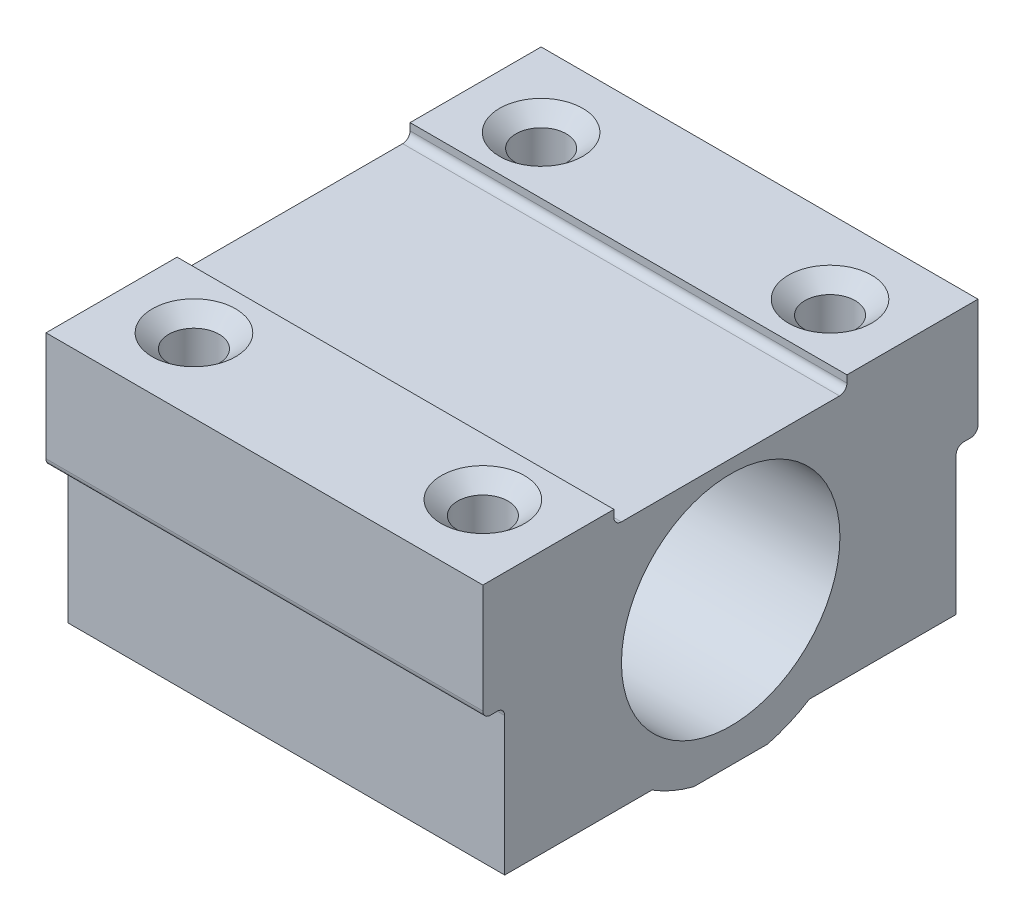
ISO-10303-21;
HEADER;
FILE_DESCRIPTION(('STEP AP214'),'2;1');
FILE_NAME('part.step','',(''),(''),'','','');
FILE_SCHEMA(('AUTOMOTIVE_DESIGN { 1 0 10303 214 1 1 1 1 }'));
ENDSEC;
DATA;
#1=APPLICATION_CONTEXT('core data for automotive mechanical design processes');
#2=APPLICATION_PROTOCOL_DEFINITION('international standard','automotive_design',2000,#1);
#3=PRODUCT_CONTEXT('',#1,'mechanical');
#4=PRODUCT('Part','Part','',(#3));
#5=PRODUCT_RELATED_PRODUCT_CATEGORY('part','',(#4));
#6=PRODUCT_DEFINITION_FORMATION('','',#4);
#7=PRODUCT_DEFINITION_CONTEXT('part definition',#1,'design');
#8=PRODUCT_DEFINITION('design','',#6,#7);
#9=PRODUCT_DEFINITION_SHAPE('','',#8);
#10=(LENGTH_UNIT() NAMED_UNIT(*) SI_UNIT(.MILLI.,.METRE.));
#11=(NAMED_UNIT(*) PLANE_ANGLE_UNIT() SI_UNIT($,.RADIAN.));
#12=(NAMED_UNIT(*) SI_UNIT($,.STERADIAN.) SOLID_ANGLE_UNIT());
#13=UNCERTAINTY_MEASURE_WITH_UNIT(LENGTH_MEASURE(1.E-05),#10,'distance_accuracy_value','');
#14=(GEOMETRIC_REPRESENTATION_CONTEXT(3) GLOBAL_UNCERTAINTY_ASSIGNED_CONTEXT((#13)) GLOBAL_UNIT_ASSIGNED_CONTEXT((#10,
#11,#12)) REPRESENTATION_CONTEXT('',''));
#15=CARTESIAN_POINT('',(0.,0.,0.));
#16=DIRECTION('',(0.,0.,1.));
#17=DIRECTION('',(1.,0.,0.));
#18=AXIS2_PLACEMENT_3D('',#15,#16,#17);
#19=CARTESIAN_POINT('',(30.,8.,0.));
#20=DIRECTION('',(0.,-1.,0.));
#21=DIRECTION('',(0.,0.,-1.));
#22=AXIS2_PLACEMENT_3D('',#19,#20,#21);
#23=PLANE('',#22);
#24=CARTESIAN_POINT('',(24.92,8.,-5.08));
#25=DIRECTION('',(0.,1.,0.));
#26=DIRECTION('',(0.,0.,1.));
#27=AXIS2_PLACEMENT_3D('',#24,#25,#26);
#28=CIRCLE('',#27,2.8575);
#29=CARTESIAN_POINT('',(24.92,8.,-2.2225));
#30=VERTEX_POINT('',#29);
#31=EDGE_CURVE('E225',#30,#30,#28,.T.);
#32=ORIENTED_EDGE('',*,*,#31,.F.);
#33=EDGE_LOOP('',(#32));
#34=FACE_BOUND('',#33,.T.);
#35=DIRECTION('',(0.,0.,1.));
#36=VECTOR('',#35,1.);
#37=CARTESIAN_POINT('',(0.,8.,0.));
#38=LINE('',#37,#36);
#39=CARTESIAN_POINT('',(0.,8.,-9.));
#40=VERTEX_POINT('',#39);
#41=CARTESIAN_POINT('',(0.,8.,0.));
#42=VERTEX_POINT('',#41);
#43=EDGE_CURVE('E320',#40,#42,#38,.T.);
#44=ORIENTED_EDGE('',*,*,#43,.T.);
#45=DIRECTION('',(-1.,0.,0.));
#46=VECTOR('',#45,1.);
#47=CARTESIAN_POINT('',(30.,8.,0.));
#48=LINE('',#47,#46);
#49=CARTESIAN_POINT('',(30.,8.,0.));
#50=VERTEX_POINT('',#49);
#51=EDGE_CURVE('E288',#50,#42,#48,.T.);
#52=ORIENTED_EDGE('',*,*,#51,.F.);
#53=DIRECTION('',(0.,0.,1.));
#54=VECTOR('',#53,1.);
#55=CARTESIAN_POINT('',(30.,8.,0.));
#56=LINE('',#55,#54);
#57=CARTESIAN_POINT('',(30.,8.,-9.));
#58=VERTEX_POINT('',#57);
#59=EDGE_CURVE('E285',#58,#50,#56,.T.);
#60=ORIENTED_EDGE('',*,*,#59,.F.);
#61=DIRECTION('',(-1.,0.,0.));
#62=VECTOR('',#61,1.);
#63=CARTESIAN_POINT('',(30.,8.,-9.));
#64=LINE('',#63,#62);
#65=EDGE_CURVE('E326',#58,#40,#64,.T.);
#66=ORIENTED_EDGE('',*,*,#65,.T.);
#67=EDGE_LOOP('',(#44,#52,#60,#66));
#68=FACE_BOUND('',#67,.T.);
#69=CARTESIAN_POINT('',(5.08,8.,-5.08));
#70=DIRECTION('',(0.,1.,0.));
#71=DIRECTION('',(0.,0.,1.));
#72=AXIS2_PLACEMENT_3D('',#69,#70,#71);
#73=CIRCLE('',#72,2.8575);
#74=CARTESIAN_POINT('',(5.08,8.,-2.2225));
#75=VERTEX_POINT('',#74);
#76=EDGE_CURVE('E234',#75,#75,#73,.T.);
#77=ORIENTED_EDGE('',*,*,#76,.F.);
#78=EDGE_LOOP('',(#77));
#79=FACE_BOUND('',#78,.T.);
#80=ADVANCED_FACE('F39',(#34,#68,#79),#23,.F.);
#81=CARTESIAN_POINT('',(30.,-1.398,-17.018));
#82=DIRECTION('',(1.,0.,0.));
#83=DIRECTION('',(0.,0.,-1.));
#84=AXIS2_PLACEMENT_3D('',#81,#82,#83);
#85=PLANE('',#84);
#86=DIRECTION('',(0.,0.,-1.));
#87=VECTOR('',#86,1.);
#88=CARTESIAN_POINT('',(30.,0.,-32.5));
#89=LINE('',#88,#87);
#90=CARTESIAN_POINT('',(30.,0.,-33.008));
#91=VERTEX_POINT('',#90);
#92=CARTESIAN_POINT('',(30.,0.,-33.492));
#93=VERTEX_POINT('',#92);
#94=EDGE_CURVE('E270',#91,#93,#89,.T.);
#95=ORIENTED_EDGE('',*,*,#94,.T.);
#96=CARTESIAN_POINT('',(30.,0.508,-33.492));
#97=DIRECTION('',(1.,0.,0.));
#98=DIRECTION('',(0.,0.,-1.));
#99=AXIS2_PLACEMENT_3D('',#96,#97,#98);
#100=CIRCLE('',#99,0.508);
#101=CARTESIAN_POINT('',(30.,0.508,-34.));
#102=VERTEX_POINT('',#101);
#103=EDGE_CURVE('E377',#93,#102,#100,.T.);
#104=ORIENTED_EDGE('',*,*,#103,.T.);
#105=DIRECTION('',(0.,1.,0.));
#106=VECTOR('',#105,1.);
#107=CARTESIAN_POINT('',(30.,0.,-34.));
#108=LINE('',#107,#106);
#109=CARTESIAN_POINT('',(30.,8.,-34.));
#110=VERTEX_POINT('',#109);
#111=EDGE_CURVE('E273',#102,#110,#108,.T.);
#112=ORIENTED_EDGE('',*,*,#111,.T.);
#113=DIRECTION('',(0.,0.,1.));
#114=VECTOR('',#113,1.);
#115=CARTESIAN_POINT('',(30.,8.,-34.));
#116=LINE('',#115,#114);
#117=CARTESIAN_POINT('',(30.,8.,-25.));
#118=VERTEX_POINT('',#117);
#119=EDGE_CURVE('E275',#110,#118,#116,.T.);
#120=ORIENTED_EDGE('',*,*,#119,.T.);
#121=DIRECTION('',(0.,-1.,0.));
#122=VECTOR('',#121,1.);
#123=CARTESIAN_POINT('',(30.,7.,-25.));
#124=LINE('',#123,#122);
#125=CARTESIAN_POINT('',(30.,7.508,-25.));
#126=VERTEX_POINT('',#125);
#127=EDGE_CURVE('E277',#118,#126,#124,.T.);
#128=ORIENTED_EDGE('',*,*,#127,.T.);
#129=CARTESIAN_POINT('',(30.,7.508,-24.492));
#130=DIRECTION('',(1.,0.,0.));
#131=DIRECTION('',(0.,0.,-1.));
#132=AXIS2_PLACEMENT_3D('',#129,#130,#131);
#133=CIRCLE('',#132,0.508);
#134=CARTESIAN_POINT('',(30.,7.,-24.492));
#135=VERTEX_POINT('',#134);
#136=EDGE_CURVE('E392',#126,#135,#133,.F.);
#137=ORIENTED_EDGE('',*,*,#136,.T.);
#138=DIRECTION('',(0.,0.,1.));
#139=VECTOR('',#138,1.);
#140=CARTESIAN_POINT('',(30.,7.,-9.));
#141=LINE('',#140,#139);
#142=CARTESIAN_POINT('',(30.,7.,-9.508));
#143=VERTEX_POINT('',#142);
#144=EDGE_CURVE('E280',#135,#143,#141,.T.);
#145=ORIENTED_EDGE('',*,*,#144,.T.);
#146=CARTESIAN_POINT('',(30.,7.508,-9.508));
#147=DIRECTION('',(1.,0.,0.));
#148=DIRECTION('',(0.,0.,-1.));
#149=AXIS2_PLACEMENT_3D('',#146,#147,#148);
#150=CIRCLE('',#149,0.508);
#151=CARTESIAN_POINT('',(30.,7.508,-9.));
#152=VERTEX_POINT('',#151);
#153=EDGE_CURVE('E396',#143,#152,#150,.F.);
#154=ORIENTED_EDGE('',*,*,#153,.T.);
#155=DIRECTION('',(0.,1.,0.));
#156=VECTOR('',#155,1.);
#157=CARTESIAN_POINT('',(30.,7.,-9.));
#158=LINE('',#157,#156);
#159=EDGE_CURVE('E283',#152,#58,#158,.T.);
#160=ORIENTED_EDGE('',*,*,#159,.T.);
#161=ORIENTED_EDGE('',*,*,#59,.T.);
#162=DIRECTION('',(0.,-1.,0.));
#163=VECTOR('',#162,1.);
#164=CARTESIAN_POINT('',(30.,0.,0.));
#165=LINE('',#164,#163);
#166=CARTESIAN_POINT('',(30.,0.508,0.));
#167=VERTEX_POINT('',#166);
#168=EDGE_CURVE('E250',#50,#167,#165,.T.);
#169=ORIENTED_EDGE('',*,*,#168,.T.);
#170=CARTESIAN_POINT('',(30.,0.508,-0.508));
#171=DIRECTION('',(1.,0.,0.));
#172=DIRECTION('',(0.,0.,-1.));
#173=AXIS2_PLACEMENT_3D('',#170,#171,#172);
#174=CIRCLE('',#173,0.508);
#175=CARTESIAN_POINT('',(30.,0.,-0.508));
#176=VERTEX_POINT('',#175);
#177=EDGE_CURVE('E375',#167,#176,#174,.T.);
#178=ORIENTED_EDGE('',*,*,#177,.T.);
#179=DIRECTION('',(0.,0.,-1.));
#180=VECTOR('',#179,1.);
#181=CARTESIAN_POINT('',(30.,0.,0.));
#182=LINE('',#181,#180);
#183=CARTESIAN_POINT('',(30.,0.,-0.992000000000001));
#184=VERTEX_POINT('',#183);
#185=EDGE_CURVE('E253',#176,#184,#182,.T.);
#186=ORIENTED_EDGE('',*,*,#185,.T.);
#187=CARTESIAN_POINT('',(30.,-0.508,-0.992000000000001));
#188=DIRECTION('',(1.,0.,0.));
#189=DIRECTION('',(0.,0.,-1.));
#190=AXIS2_PLACEMENT_3D('',#187,#188,#189);
#191=CIRCLE('',#190,0.508);
#192=CARTESIAN_POINT('',(30.,-0.508,-1.5));
#193=VERTEX_POINT('',#192);
#194=EDGE_CURVE('E11',#184,#193,#191,.F.);
#195=ORIENTED_EDGE('',*,*,#194,.T.);
#196=DIRECTION('',(0.,-1.,0.));
#197=VECTOR('',#196,1.);
#198=CARTESIAN_POINT('',(30.,0.,-1.5));
#199=LINE('',#198,#197);
#200=CARTESIAN_POINT('',(30.,-10.,-1.5));
#201=VERTEX_POINT('',#200);
#202=EDGE_CURVE('E256',#193,#201,#199,.T.);
#203=ORIENTED_EDGE('',*,*,#202,.T.);
#204=DIRECTION('',(0.,0.,-1.));
#205=VECTOR('',#204,1.);
#206=CARTESIAN_POINT('',(30.,-10.,-1.5));
#207=LINE('',#206,#205);
#208=CARTESIAN_POINT('',(30.,-10.,-11.6114117967058));
#209=VERTEX_POINT('',#208);
#210=EDGE_CURVE('E258',#201,#209,#207,.T.);
#211=ORIENTED_EDGE('',*,*,#210,.T.);
#212=CARTESIAN_POINT('',(30.,-1.398,-17.018));
#213=DIRECTION('',(1.,0.,0.));
#214=DIRECTION('',(0.,0.,-1.));
#215=AXIS2_PLACEMENT_3D('',#212,#213,#214);
#216=CIRCLE('',#215,10.16);
#217=CARTESIAN_POINT('',(30.,-11.2375684973966,-14.4865000918347));
#218=VERTEX_POINT('',#217);
#219=EDGE_CURVE('E260',#209,#218,#216,.T.);
#220=ORIENTED_EDGE('',*,*,#219,.T.);
#221=DIRECTION('',(0.,0.,-1.));
#222=VECTOR('',#221,1.);
#223=CARTESIAN_POINT('',(30.,-11.2375684973966,-14.4865000918347));
#224=LINE('',#223,#222);
#225=CARTESIAN_POINT('',(30.,-11.2375684973966,-19.5494999081653));
#226=VERTEX_POINT('',#225);
#227=EDGE_CURVE('E262',#218,#226,#224,.T.);
#228=ORIENTED_EDGE('',*,*,#227,.T.);
#229=CARTESIAN_POINT('',(30.,-1.398,-17.018));
#230=DIRECTION('',(1.,0.,0.));
#231=DIRECTION('',(0.,0.,-1.));
#232=AXIS2_PLACEMENT_3D('',#229,#230,#231);
#233=CIRCLE('',#232,10.16);
#234=CARTESIAN_POINT('',(30.,-10.,-22.4245882032942));
#235=VERTEX_POINT('',#234);
#236=EDGE_CURVE('E264',#226,#235,#233,.T.);
#237=ORIENTED_EDGE('',*,*,#236,.T.);
#238=DIRECTION('',(0.,0.,-1.));
#239=VECTOR('',#238,1.);
#240=CARTESIAN_POINT('',(30.,-10.,-22.4245882032942));
#241=LINE('',#240,#239);
#242=CARTESIAN_POINT('',(30.,-10.,-32.5));
#243=VERTEX_POINT('',#242);
#244=EDGE_CURVE('E266',#235,#243,#241,.T.);
#245=ORIENTED_EDGE('',*,*,#244,.T.);
#246=DIRECTION('',(0.,1.,0.));
#247=VECTOR('',#246,1.);
#248=CARTESIAN_POINT('',(30.,0.,-32.5));
#249=LINE('',#248,#247);
#250=CARTESIAN_POINT('',(30.,-0.508,-32.5));
#251=VERTEX_POINT('',#250);
#252=EDGE_CURVE('E268',#243,#251,#249,.T.);
#253=ORIENTED_EDGE('',*,*,#252,.T.);
#254=CARTESIAN_POINT('',(30.,-0.508,-33.008));
#255=DIRECTION('',(1.,0.,0.));
#256=DIRECTION('',(0.,0.,-1.));
#257=AXIS2_PLACEMENT_3D('',#254,#255,#256);
#258=CIRCLE('',#257,0.508);
#259=EDGE_CURVE('E400',#251,#91,#258,.F.);
#260=ORIENTED_EDGE('',*,*,#259,.T.);
#261=EDGE_LOOP('',(#95,#104,#112,#120,#128,#137,#145,#154,#160,#161,#169,#178,#186,#195,#203,
#211,#220,#228,#237,#245,#253,#260));
#262=FACE_BOUND('',#261,.T.);
#263=CARTESIAN_POINT('',(30.,-1.398,-17.018));
#264=DIRECTION('',(1.,0.,0.));
#265=DIRECTION('',(0.,0.,-1.));
#266=AXIS2_PLACEMENT_3D('',#263,#264,#265);
#267=CIRCLE('',#266,7.5);
#268=CARTESIAN_POINT('',(30.,-1.398,-24.518));
#269=VERTEX_POINT('',#268);
#270=EDGE_CURVE('E244',#269,#269,#267,.T.);
#271=ORIENTED_EDGE('',*,*,#270,.F.);
#272=EDGE_LOOP('',(#271));
#273=FACE_BOUND('',#272,.T.);
#274=ADVANCED_FACE('F419',(#262,#273),#85,.T.);
#275=CARTESIAN_POINT('',(0.,-1.398,-17.018));
#276=DIRECTION('',(1.,0.,0.));
#277=DIRECTION('',(0.,0.,-1.));
#278=AXIS2_PLACEMENT_3D('',#275,#276,#277);
#279=PLANE('',#278);
#280=DIRECTION('',(0.,1.,0.));
#281=VECTOR('',#280,1.);
#282=CARTESIAN_POINT('',(0.,7.49375,-34.));
#283=LINE('',#282,#281);
#284=CARTESIAN_POINT('',(0.,0.508,-34.));
#285=VERTEX_POINT('',#284);
#286=CARTESIAN_POINT('',(0.,8.,-34.));
#287=VERTEX_POINT('',#286);
#288=EDGE_CURVE('E308',#285,#287,#283,.T.);
#289=ORIENTED_EDGE('',*,*,#288,.F.);
#290=CARTESIAN_POINT('',(0.,0.508,-33.492));
#291=DIRECTION('',(1.,0.,0.));
#292=DIRECTION('',(0.,0.,-1.));
#293=AXIS2_PLACEMENT_3D('',#290,#291,#292);
#294=CIRCLE('',#293,0.508);
#295=CARTESIAN_POINT('',(0.,0.,-33.492));
#296=VERTEX_POINT('',#295);
#297=EDGE_CURVE('E368',#285,#296,#294,.F.);
#298=ORIENTED_EDGE('',*,*,#297,.T.);
#299=DIRECTION('',(0.,0.,-1.));
#300=VECTOR('',#299,1.);
#301=CARTESIAN_POINT('',(0.,0.,-32.5));
#302=LINE('',#301,#300);
#303=CARTESIAN_POINT('',(0.,0.,-33.008));
#304=VERTEX_POINT('',#303);
#305=EDGE_CURVE('E305',#304,#296,#302,.T.);
#306=ORIENTED_EDGE('',*,*,#305,.F.);
#307=CARTESIAN_POINT('',(0.,-0.508,-33.008));
#308=DIRECTION('',(1.,0.,0.));
#309=DIRECTION('',(0.,0.,-1.));
#310=AXIS2_PLACEMENT_3D('',#307,#308,#309);
#311=CIRCLE('',#310,0.508);
#312=CARTESIAN_POINT('',(0.,-0.508,-32.5));
#313=VERTEX_POINT('',#312);
#314=EDGE_CURVE('E398',#304,#313,#311,.T.);
#315=ORIENTED_EDGE('',*,*,#314,.T.);
#316=DIRECTION('',(0.,1.,0.));
#317=VECTOR('',#316,1.);
#318=CARTESIAN_POINT('',(0.,0.,-32.5));
#319=LINE('',#318,#317);
#320=CARTESIAN_POINT('',(0.,-10.,-32.5));
#321=VERTEX_POINT('',#320);
#322=EDGE_CURVE('E303',#321,#313,#319,.T.);
#323=ORIENTED_EDGE('',*,*,#322,.F.);
#324=DIRECTION('',(0.,0.,-1.));
#325=VECTOR('',#324,1.);
#326=CARTESIAN_POINT('',(0.,-10.,-22.4245882032942));
#327=LINE('',#326,#325);
#328=CARTESIAN_POINT('',(0.,-10.,-22.4245882032942));
#329=VERTEX_POINT('',#328);
#330=EDGE_CURVE('E301',#329,#321,#327,.T.);
#331=ORIENTED_EDGE('',*,*,#330,.F.);
#332=CARTESIAN_POINT('',(0.,-1.398,-17.018));
#333=DIRECTION('',(1.,0.,0.));
#334=DIRECTION('',(0.,0.,-1.));
#335=AXIS2_PLACEMENT_3D('',#332,#333,#334);
#336=CIRCLE('',#335,10.16);
#337=CARTESIAN_POINT('',(0.,-11.2375684973966,-19.5494999081653));
#338=VERTEX_POINT('',#337);
#339=EDGE_CURVE('E299',#338,#329,#336,.T.);
#340=ORIENTED_EDGE('',*,*,#339,.F.);
#341=DIRECTION('',(0.,0.,-1.));
#342=VECTOR('',#341,1.);
#343=CARTESIAN_POINT('',(0.,-11.2375684973966,-14.4865000918347));
#344=LINE('',#343,#342);
#345=CARTESIAN_POINT('',(0.,-11.2375684973966,-14.4865000918347));
#346=VERTEX_POINT('',#345);
#347=EDGE_CURVE('E297',#346,#338,#344,.T.);
#348=ORIENTED_EDGE('',*,*,#347,.F.);
#349=CARTESIAN_POINT('',(0.,-1.398,-17.018));
#350=DIRECTION('',(1.,0.,0.));
#351=DIRECTION('',(0.,0.,-1.));
#352=AXIS2_PLACEMENT_3D('',#349,#350,#351);
#353=CIRCLE('',#352,10.16);
#354=CARTESIAN_POINT('',(0.,-10.,-11.6114117967058));
#355=VERTEX_POINT('',#354);
#356=EDGE_CURVE('E295',#355,#346,#353,.T.);
#357=ORIENTED_EDGE('',*,*,#356,.F.);
#358=DIRECTION('',(0.,0.,-1.));
#359=VECTOR('',#358,1.);
#360=CARTESIAN_POINT('',(0.,-10.,-1.5));
#361=LINE('',#360,#359);
#362=CARTESIAN_POINT('',(0.,-10.,-1.5));
#363=VERTEX_POINT('',#362);
#364=EDGE_CURVE('E293',#363,#355,#361,.T.);
#365=ORIENTED_EDGE('',*,*,#364,.F.);
#366=DIRECTION('',(0.,-1.,0.));
#367=VECTOR('',#366,1.);
#368=CARTESIAN_POINT('',(0.,0.,-1.5));
#369=LINE('',#368,#367);
#370=CARTESIAN_POINT('',(0.,-0.508,-1.5));
#371=VERTEX_POINT('',#370);
#372=EDGE_CURVE('E291',#371,#363,#369,.T.);
#373=ORIENTED_EDGE('',*,*,#372,.F.);
#374=CARTESIAN_POINT('',(0.,-0.508,-0.992000000000001));
#375=DIRECTION('',(1.,0.,0.));
#376=DIRECTION('',(0.,0.,-1.));
#377=AXIS2_PLACEMENT_3D('',#374,#375,#376);
#378=CIRCLE('',#377,0.508);
#379=CARTESIAN_POINT('',(0.,0.,-0.992000000000001));
#380=VERTEX_POINT('',#379);
#381=EDGE_CURVE('E47',#371,#380,#378,.T.);
#382=ORIENTED_EDGE('',*,*,#381,.T.);
#383=DIRECTION('',(0.,0.,-1.));
#384=VECTOR('',#383,1.);
#385=CARTESIAN_POINT('',(0.,0.,0.));
#386=LINE('',#385,#384);
#387=CARTESIAN_POINT('',(0.,0.,-0.508));
#388=VERTEX_POINT('',#387);
#389=EDGE_CURVE('E247',#388,#380,#386,.T.);
#390=ORIENTED_EDGE('',*,*,#389,.F.);
#391=CARTESIAN_POINT('',(0.,0.508,-0.508));
#392=DIRECTION('',(1.,0.,0.));
#393=DIRECTION('',(0.,0.,-1.));
#394=AXIS2_PLACEMENT_3D('',#391,#392,#393);
#395=CIRCLE('',#394,0.508);
#396=CARTESIAN_POINT('',(0.,0.508,0.));
#397=VERTEX_POINT('',#396);
#398=EDGE_CURVE('E366',#388,#397,#395,.F.);
#399=ORIENTED_EDGE('',*,*,#398,.T.);
#400=DIRECTION('',(0.,-1.,0.));
#401=VECTOR('',#400,1.);
#402=CARTESIAN_POINT('',(0.,7.49375,0.));
#403=LINE('',#402,#401);
#404=EDGE_CURVE('E254',#42,#397,#403,.T.);
#405=ORIENTED_EDGE('',*,*,#404,.F.);
#406=ORIENTED_EDGE('',*,*,#43,.F.);
#407=DIRECTION('',(0.,1.,0.));
#408=VECTOR('',#407,1.);
#409=CARTESIAN_POINT('',(0.,7.,-9.));
#410=LINE('',#409,#408);
#411=CARTESIAN_POINT('',(0.,7.508,-9.));
#412=VERTEX_POINT('',#411);
#413=EDGE_CURVE('E318',#412,#40,#410,.T.);
#414=ORIENTED_EDGE('',*,*,#413,.F.);
#415=CARTESIAN_POINT('',(0.,7.508,-9.508));
#416=DIRECTION('',(1.,0.,0.));
#417=DIRECTION('',(0.,0.,-1.));
#418=AXIS2_PLACEMENT_3D('',#415,#416,#417);
#419=CIRCLE('',#418,0.508);
#420=CARTESIAN_POINT('',(0.,7.,-9.508));
#421=VERTEX_POINT('',#420);
#422=EDGE_CURVE('E394',#412,#421,#419,.T.);
#423=ORIENTED_EDGE('',*,*,#422,.T.);
#424=DIRECTION('',(0.,0.,1.));
#425=VECTOR('',#424,1.);
#426=CARTESIAN_POINT('',(0.,7.,-9.));
#427=LINE('',#426,#425);
#428=CARTESIAN_POINT('',(0.,7.,-24.492));
#429=VERTEX_POINT('',#428);
#430=EDGE_CURVE('E315',#429,#421,#427,.T.);
#431=ORIENTED_EDGE('',*,*,#430,.F.);
#432=CARTESIAN_POINT('',(0.,7.508,-24.492));
#433=DIRECTION('',(1.,0.,0.));
#434=DIRECTION('',(0.,0.,-1.));
#435=AXIS2_PLACEMENT_3D('',#432,#433,#434);
#436=CIRCLE('',#435,0.508);
#437=CARTESIAN_POINT('',(0.,7.508,-25.));
#438=VERTEX_POINT('',#437);
#439=EDGE_CURVE('E390',#429,#438,#436,.T.);
#440=ORIENTED_EDGE('',*,*,#439,.T.);
#441=DIRECTION('',(0.,-1.,0.));
#442=VECTOR('',#441,1.);
#443=CARTESIAN_POINT('',(0.,7.,-25.));
#444=LINE('',#443,#442);
#445=CARTESIAN_POINT('',(0.,8.,-25.));
#446=VERTEX_POINT('',#445);
#447=EDGE_CURVE('E312',#446,#438,#444,.T.);
#448=ORIENTED_EDGE('',*,*,#447,.F.);
#449=DIRECTION('',(0.,0.,1.));
#450=VECTOR('',#449,1.);
#451=CARTESIAN_POINT('',(0.,8.,-34.));
#452=LINE('',#451,#450);
#453=EDGE_CURVE('E310',#287,#446,#452,.T.);
#454=ORIENTED_EDGE('',*,*,#453,.F.);
#455=EDGE_LOOP('',(#289,#298,#306,#315,#323,#331,#340,#348,#357,#365,#373,#382,#390,#399,#405,
#406,#414,#423,#431,#440,#448,#454));
#456=FACE_BOUND('',#455,.T.);
#457=CARTESIAN_POINT('',(0.,-1.398,-17.018));
#458=DIRECTION('',(1.,0.,0.));
#459=DIRECTION('',(0.,0.,-1.));
#460=AXIS2_PLACEMENT_3D('',#457,#458,#459);
#461=CIRCLE('',#460,7.5);
#462=CARTESIAN_POINT('',(0.,-1.398,-24.518));
#463=VERTEX_POINT('',#462);
#464=EDGE_CURVE('E243',#463,#463,#461,.T.);
#465=ORIENTED_EDGE('',*,*,#464,.T.);
#466=EDGE_LOOP('',(#465));
#467=FACE_BOUND('',#466,.T.);
#468=ADVANCED_FACE('F405',(#456,#467),#279,.F.);
#469=CARTESIAN_POINT('',(30.,0.,0.));
#470=DIRECTION('',(0.,1.,0.));
#471=DIRECTION('',(0.,0.,1.));
#472=AXIS2_PLACEMENT_3D('',#469,#470,#471);
#473=PLANE('',#472);
#474=ORIENTED_EDGE('',*,*,#185,.F.);
#475=DIRECTION('',(-1.,0.,0.));
#476=VECTOR('',#475,1.);
#477=CARTESIAN_POINT('',(30.,0.,-0.508));
#478=LINE('',#477,#476);
#479=EDGE_CURVE('E382',#176,#388,#478,.T.);
#480=ORIENTED_EDGE('',*,*,#479,.T.);
#481=ORIENTED_EDGE('',*,*,#389,.T.);
#482=DIRECTION('',(-1.,0.,0.));
#483=VECTOR('',#482,1.);
#484=CARTESIAN_POINT('',(30.,0.,-0.992000000000001));
#485=LINE('',#484,#483);
#486=EDGE_CURVE('E380',#380,#184,#485,.F.);
#487=ORIENTED_EDGE('',*,*,#486,.T.);
#488=EDGE_LOOP('',(#474,#480,#481,#487));
#489=FACE_BOUND('',#488,.T.);
#490=ADVANCED_FACE('F413',(#489),#473,.F.);
#491=CARTESIAN_POINT('',(30.,0.,-1.5));
#492=DIRECTION('',(0.,0.,-1.));
#493=DIRECTION('',(0.,1.,0.));
#494=AXIS2_PLACEMENT_3D('',#491,#492,#493);
#495=PLANE('',#494);
#496=ORIENTED_EDGE('',*,*,#202,.F.);
#497=DIRECTION('',(-1.,0.,0.));
#498=VECTOR('',#497,1.);
#499=CARTESIAN_POINT('',(0.,-0.508,-1.5));
#500=LINE('',#499,#498);
#501=EDGE_CURVE('E387',#193,#371,#500,.T.);
#502=ORIENTED_EDGE('',*,*,#501,.T.);
#503=ORIENTED_EDGE('',*,*,#372,.T.);
#504=DIRECTION('',(-1.,0.,0.));
#505=VECTOR('',#504,1.);
#506=CARTESIAN_POINT('',(30.,-10.,-1.5));
#507=LINE('',#506,#505);
#508=EDGE_CURVE('E350',#201,#363,#507,.T.);
#509=ORIENTED_EDGE('',*,*,#508,.F.);
#510=EDGE_LOOP('',(#496,#502,#503,#509));
#511=FACE_BOUND('',#510,.T.);
#512=ADVANCED_FACE('F416',(#511),#495,.F.);
#513=CARTESIAN_POINT('',(30.,-10.,-1.5));
#514=DIRECTION('',(0.,1.,0.));
#515=DIRECTION('',(0.,0.,1.));
#516=AXIS2_PLACEMENT_3D('',#513,#514,#515);
#517=PLANE('',#516);
#518=ORIENTED_EDGE('',*,*,#364,.T.);
#519=DIRECTION('',(-1.,0.,0.));
#520=VECTOR('',#519,1.);
#521=CARTESIAN_POINT('',(30.,-10.,-11.6114117967058));
#522=LINE('',#521,#520);
#523=EDGE_CURVE('E347',#209,#355,#522,.T.);
#524=ORIENTED_EDGE('',*,*,#523,.F.);
#525=ORIENTED_EDGE('',*,*,#210,.F.);
#526=ORIENTED_EDGE('',*,*,#508,.T.);
#527=EDGE_LOOP('',(#518,#524,#525,#526));
#528=FACE_BOUND('',#527,.T.);
#529=ADVANCED_FACE('F425',(#528),#517,.F.);
#530=CARTESIAN_POINT('',(30.,-1.398,-17.018));
#531=DIRECTION('',(-1.,0.,0.));
#532=DIRECTION('',(0.,0.,1.));
#533=AXIS2_PLACEMENT_3D('',#530,#531,#532);
#534=CYLINDRICAL_SURFACE('',#533,10.16);
#535=ORIENTED_EDGE('',*,*,#356,.T.);
#536=DIRECTION('',(-1.,0.,0.));
#537=VECTOR('',#536,1.);
#538=CARTESIAN_POINT('',(30.,-11.2375684973966,-14.4865000918347));
#539=LINE('',#538,#537);
#540=EDGE_CURVE('E344',#218,#346,#539,.T.);
#541=ORIENTED_EDGE('',*,*,#540,.F.);
#542=ORIENTED_EDGE('',*,*,#219,.F.);
#543=ORIENTED_EDGE('',*,*,#523,.T.);
#544=EDGE_LOOP('',(#535,#541,#542,#543));
#545=FACE_BOUND('',#544,.T.);
#546=ADVANCED_FACE('F428',(#545),#534,.T.);
#547=CARTESIAN_POINT('',(30.,-11.2375684973966,-14.4865000918347));
#548=DIRECTION('',(0.,1.,0.));
#549=DIRECTION('',(0.,0.,1.));
#550=AXIS2_PLACEMENT_3D('',#547,#548,#549);
#551=PLANE('',#550);
#552=ORIENTED_EDGE('',*,*,#347,.T.);
#553=DIRECTION('',(-1.,0.,0.));
#554=VECTOR('',#553,1.);
#555=CARTESIAN_POINT('',(30.,-11.2375684973966,-19.5494999081653));
#556=LINE('',#555,#554);
#557=EDGE_CURVE('E341',#226,#338,#556,.T.);
#558=ORIENTED_EDGE('',*,*,#557,.F.);
#559=ORIENTED_EDGE('',*,*,#227,.F.);
#560=ORIENTED_EDGE('',*,*,#540,.T.);
#561=EDGE_LOOP('',(#552,#558,#559,#560));
#562=FACE_BOUND('',#561,.T.);
#563=ADVANCED_FACE('F433',(#562),#551,.F.);
#564=CARTESIAN_POINT('',(30.,-1.398,-17.018));
#565=DIRECTION('',(-1.,0.,0.));
#566=DIRECTION('',(0.,0.,1.));
#567=AXIS2_PLACEMENT_3D('',#564,#565,#566);
#568=CYLINDRICAL_SURFACE('',#567,10.16);
#569=ORIENTED_EDGE('',*,*,#339,.T.);
#570=DIRECTION('',(-1.,0.,0.));
#571=VECTOR('',#570,1.);
#572=CARTESIAN_POINT('',(30.,-10.,-22.4245882032942));
#573=LINE('',#572,#571);
#574=EDGE_CURVE('E338',#235,#329,#573,.T.);
#575=ORIENTED_EDGE('',*,*,#574,.F.);
#576=ORIENTED_EDGE('',*,*,#236,.F.);
#577=ORIENTED_EDGE('',*,*,#557,.T.);
#578=EDGE_LOOP('',(#569,#575,#576,#577));
#579=FACE_BOUND('',#578,.T.);
#580=ADVANCED_FACE('F439',(#579),#568,.T.);
#581=CARTESIAN_POINT('',(30.,-10.,-22.4245882032942));
#582=DIRECTION('',(0.,1.,0.));
#583=DIRECTION('',(0.,0.,1.));
#584=AXIS2_PLACEMENT_3D('',#581,#582,#583);
#585=PLANE('',#584);
#586=ORIENTED_EDGE('',*,*,#330,.T.);
#587=DIRECTION('',(-1.,0.,0.));
#588=VECTOR('',#587,1.);
#589=CARTESIAN_POINT('',(30.,-10.,-32.5));
#590=LINE('',#589,#588);
#591=EDGE_CURVE('E335',#243,#321,#590,.T.);
#592=ORIENTED_EDGE('',*,*,#591,.F.);
#593=ORIENTED_EDGE('',*,*,#244,.F.);
#594=ORIENTED_EDGE('',*,*,#574,.T.);
#595=EDGE_LOOP('',(#586,#592,#593,#594));
#596=FACE_BOUND('',#595,.T.);
#597=ADVANCED_FACE('F443',(#596),#585,.F.);
#598=CARTESIAN_POINT('',(30.,0.,-32.5));
#599=DIRECTION('',(0.,0.,1.));
#600=DIRECTION('',(1.,0.,0.));
#601=AXIS2_PLACEMENT_3D('',#598,#599,#600);
#602=PLANE('',#601);
#603=ORIENTED_EDGE('',*,*,#322,.T.);
#604=DIRECTION('',(-1.,0.,0.));
#605=VECTOR('',#604,1.);
#606=CARTESIAN_POINT('',(30.,-0.508,-32.5));
#607=LINE('',#606,#605);
#608=EDGE_CURVE('E54',#313,#251,#607,.F.);
#609=ORIENTED_EDGE('',*,*,#608,.T.);
#610=ORIENTED_EDGE('',*,*,#252,.F.);
#611=ORIENTED_EDGE('',*,*,#591,.T.);
#612=EDGE_LOOP('',(#603,#609,#610,#611));
#613=FACE_BOUND('',#612,.T.);
#614=ADVANCED_FACE('F445',(#613),#602,.F.);
#615=CARTESIAN_POINT('',(30.,0.,-32.5));
#616=DIRECTION('',(0.,1.,0.));
#617=DIRECTION('',(0.,0.,1.));
#618=AXIS2_PLACEMENT_3D('',#615,#616,#617);
#619=PLANE('',#618);
#620=ORIENTED_EDGE('',*,*,#305,.T.);
#621=DIRECTION('',(-1.,0.,0.));
#622=VECTOR('',#621,1.);
#623=CARTESIAN_POINT('',(30.,0.,-33.492));
#624=LINE('',#623,#622);
#625=EDGE_CURVE('E373',#296,#93,#624,.F.);
#626=ORIENTED_EDGE('',*,*,#625,.T.);
#627=ORIENTED_EDGE('',*,*,#94,.F.);
#628=DIRECTION('',(-1.,0.,0.));
#629=VECTOR('',#628,1.);
#630=CARTESIAN_POINT('',(0.,0.,-33.008));
#631=LINE('',#630,#629);
#632=EDGE_CURVE('E370',#91,#304,#631,.T.);
#633=ORIENTED_EDGE('',*,*,#632,.T.);
#634=EDGE_LOOP('',(#620,#626,#627,#633));
#635=FACE_BOUND('',#634,.T.);
#636=ADVANCED_FACE('F453',(#635),#619,.F.);
#637=CARTESIAN_POINT('',(30.,7.49375,-34.));
#638=DIRECTION('',(0.,0.,1.));
#639=DIRECTION('',(1.,0.,0.));
#640=AXIS2_PLACEMENT_3D('',#637,#638,#639);
#641=PLANE('',#640);
#642=ORIENTED_EDGE('',*,*,#111,.F.);
#643=DIRECTION('',(-1.,0.,0.));
#644=VECTOR('',#643,1.);
#645=CARTESIAN_POINT('',(30.,0.508,-34.));
#646=LINE('',#645,#644);
#647=EDGE_CURVE('E363',#102,#285,#646,.T.);
#648=ORIENTED_EDGE('',*,*,#647,.T.);
#649=ORIENTED_EDGE('',*,*,#288,.T.);
#650=DIRECTION('',(-1.,0.,0.));
#651=VECTOR('',#650,1.);
#652=CARTESIAN_POINT('',(30.,8.,-34.));
#653=LINE('',#652,#651);
#654=EDGE_CURVE('E332',#110,#287,#653,.T.);
#655=ORIENTED_EDGE('',*,*,#654,.F.);
#656=EDGE_LOOP('',(#642,#648,#649,#655));
#657=FACE_BOUND('',#656,.T.);
#658=ADVANCED_FACE('F462',(#657),#641,.F.);
#659=CARTESIAN_POINT('',(30.,8.,-34.));
#660=DIRECTION('',(0.,-1.,0.));
#661=DIRECTION('',(0.,0.,-1.));
#662=AXIS2_PLACEMENT_3D('',#659,#660,#661);
#663=PLANE('',#662);
#664=CARTESIAN_POINT('',(5.08,8.,-28.92));
#665=DIRECTION('',(0.,1.,0.));
#666=DIRECTION('',(0.,0.,1.));
#667=AXIS2_PLACEMENT_3D('',#664,#665,#666);
#668=CIRCLE('',#667,2.8575);
#669=CARTESIAN_POINT('',(5.08,8.,-26.0625));
#670=VERTEX_POINT('',#669);
#671=EDGE_CURVE('E216',#670,#670,#668,.T.);
#672=ORIENTED_EDGE('',*,*,#671,.F.);
#673=EDGE_LOOP('',(#672));
#674=FACE_BOUND('',#673,.T.);
#675=CARTESIAN_POINT('',(24.92,8.,-28.92));
#676=DIRECTION('',(0.,1.,0.));
#677=DIRECTION('',(0.,0.,1.));
#678=AXIS2_PLACEMENT_3D('',#675,#676,#677);
#679=CIRCLE('',#678,2.8575);
#680=CARTESIAN_POINT('',(24.92,8.,-26.0625));
#681=VERTEX_POINT('',#680);
#682=EDGE_CURVE('E209',#681,#681,#679,.T.);
#683=ORIENTED_EDGE('',*,*,#682,.F.);
#684=EDGE_LOOP('',(#683));
#685=FACE_BOUND('',#684,.T.);
#686=ORIENTED_EDGE('',*,*,#453,.T.);
#687=DIRECTION('',(-1.,0.,0.));
#688=VECTOR('',#687,1.);
#689=CARTESIAN_POINT('',(30.,8.,-25.));
#690=LINE('',#689,#688);
#691=EDGE_CURVE('E329',#118,#446,#690,.T.);
#692=ORIENTED_EDGE('',*,*,#691,.F.);
#693=ORIENTED_EDGE('',*,*,#119,.F.);
#694=ORIENTED_EDGE('',*,*,#654,.T.);
#695=EDGE_LOOP('',(#686,#692,#693,#694));
#696=FACE_BOUND('',#695,.T.);
#697=ADVANCED_FACE('F469',(#674,#685,#696),#663,.F.);
#698=CARTESIAN_POINT('',(30.,7.,-25.));
#699=DIRECTION('',(0.,0.,-1.));
#700=DIRECTION('',(-1.,0.,0.));
#701=AXIS2_PLACEMENT_3D('',#698,#699,#700);
#702=PLANE('',#701);
#703=ORIENTED_EDGE('',*,*,#447,.T.);
#704=DIRECTION('',(-1.,0.,0.));
#705=VECTOR('',#704,1.);
#706=CARTESIAN_POINT('',(30.,7.508,-25.));
#707=LINE('',#706,#705);
#708=EDGE_CURVE('E358',#438,#126,#707,.F.);
#709=ORIENTED_EDGE('',*,*,#708,.T.);
#710=ORIENTED_EDGE('',*,*,#127,.F.);
#711=ORIENTED_EDGE('',*,*,#691,.T.);
#712=EDGE_LOOP('',(#703,#709,#710,#711));
#713=FACE_BOUND('',#712,.T.);
#714=ADVANCED_FACE('F472',(#713),#702,.F.);
#715=CARTESIAN_POINT('',(30.,7.,-9.));
#716=DIRECTION('',(0.,-1.,0.));
#717=DIRECTION('',(0.,0.,-1.));
#718=AXIS2_PLACEMENT_3D('',#715,#716,#717);
#719=PLANE('',#718);
#720=ORIENTED_EDGE('',*,*,#144,.F.);
#721=DIRECTION('',(-1.,0.,0.));
#722=VECTOR('',#721,1.);
#723=CARTESIAN_POINT('',(0.,7.,-24.492));
#724=LINE('',#723,#722);
#725=EDGE_CURVE('E355',#135,#429,#724,.T.);
#726=ORIENTED_EDGE('',*,*,#725,.T.);
#727=ORIENTED_EDGE('',*,*,#430,.T.);
#728=DIRECTION('',(-1.,0.,0.));
#729=VECTOR('',#728,1.);
#730=CARTESIAN_POINT('',(30.,7.,-9.508));
#731=LINE('',#730,#729);
#732=EDGE_CURVE('E353',#421,#143,#731,.F.);
#733=ORIENTED_EDGE('',*,*,#732,.T.);
#734=EDGE_LOOP('',(#720,#726,#727,#733));
#735=FACE_BOUND('',#734,.T.);
#736=ADVANCED_FACE('F480',(#735),#719,.F.);
#737=CARTESIAN_POINT('',(30.,7.,-9.));
#738=DIRECTION('',(0.,0.,1.));
#739=DIRECTION('',(1.,0.,0.));
#740=AXIS2_PLACEMENT_3D('',#737,#738,#739);
#741=PLANE('',#740);
#742=ORIENTED_EDGE('',*,*,#159,.F.);
#743=DIRECTION('',(-1.,0.,0.));
#744=VECTOR('',#743,1.);
#745=CARTESIAN_POINT('',(0.,7.508,-9.));
#746=LINE('',#745,#744);
#747=EDGE_CURVE('E360',#152,#412,#746,.T.);
#748=ORIENTED_EDGE('',*,*,#747,.T.);
#749=ORIENTED_EDGE('',*,*,#413,.T.);
#750=ORIENTED_EDGE('',*,*,#65,.F.);
#751=EDGE_LOOP('',(#742,#748,#749,#750));
#752=FACE_BOUND('',#751,.T.);
#753=ADVANCED_FACE('F489',(#752),#741,.F.);
#754=CARTESIAN_POINT('',(30.,7.49375,0.));
#755=DIRECTION('',(0.,0.,-1.));
#756=DIRECTION('',(-1.,0.,0.));
#757=AXIS2_PLACEMENT_3D('',#754,#755,#756);
#758=PLANE('',#757);
#759=ORIENTED_EDGE('',*,*,#404,.T.);
#760=DIRECTION('',(-1.,0.,0.));
#761=VECTOR('',#760,1.);
#762=CARTESIAN_POINT('',(30.,0.508,0.));
#763=LINE('',#762,#761);
#764=EDGE_CURVE('E385',#397,#167,#763,.F.);
#765=ORIENTED_EDGE('',*,*,#764,.T.);
#766=ORIENTED_EDGE('',*,*,#168,.F.);
#767=ORIENTED_EDGE('',*,*,#51,.T.);
#768=EDGE_LOOP('',(#759,#765,#766,#767));
#769=FACE_BOUND('',#768,.T.);
#770=ADVANCED_FACE('F502',(#769),#758,.F.);
#771=CARTESIAN_POINT('',(30.,-1.398,-17.018));
#772=DIRECTION('',(-1.,0.,0.));
#773=DIRECTION('',(0.,0.,1.));
#774=AXIS2_PLACEMENT_3D('',#771,#772,#773);
#775=CYLINDRICAL_SURFACE('',#774,7.5);
#776=ORIENTED_EDGE('',*,*,#270,.T.);
#777=EDGE_LOOP('',(#776));
#778=FACE_BOUND('',#777,.T.);
#779=ORIENTED_EDGE('',*,*,#464,.F.);
#780=EDGE_LOOP('',(#779));
#781=FACE_BOUND('',#780,.T.);
#782=ADVANCED_FACE('F504',(#778,#781),#775,.F.);
#783=CARTESIAN_POINT('',(5.08,1.65,-5.08));
#784=DIRECTION('',(0.,1.,0.));
#785=DIRECTION('',(0.,0.,1.));
#786=AXIS2_PLACEMENT_3D('',#783,#784,#785);
#787=CONICAL_SURFACE('',#786,1.7272,1.02974425867665);
#788=CARTESIAN_POINT('',(5.08,0.612193538815598,-5.08));
#789=VERTEX_POINT('',#788);
#790=VERTEX_LOOP('',#789);
#791=FACE_BOUND('',#790,.T.);
#792=CARTESIAN_POINT('',(5.08,1.65,-5.08));
#793=DIRECTION('',(0.,1.,0.));
#794=DIRECTION('',(0.,0.,1.));
#795=AXIS2_PLACEMENT_3D('',#792,#793,#794);
#796=CIRCLE('',#795,1.7272);
#797=CARTESIAN_POINT('',(5.08,1.65,-3.3528));
#798=VERTEX_POINT('',#797);
#799=EDGE_CURVE('E240',#798,#798,#796,.T.);
#800=ORIENTED_EDGE('',*,*,#799,.T.);
#801=EDGE_LOOP('',(#800));
#802=FACE_BOUND('',#801,.T.);
#803=ADVANCED_FACE('F510',(#791,#802),#787,.F.);
#804=CARTESIAN_POINT('',(5.08,8.,-5.08));
#805=DIRECTION('',(0.,1.,0.));
#806=DIRECTION('',(0.,0.,1.));
#807=AXIS2_PLACEMENT_3D('',#804,#805,#806);
#808=CYLINDRICAL_SURFACE('',#807,1.7272);
#809=ORIENTED_EDGE('',*,*,#799,.F.);
#810=EDGE_LOOP('',(#809));
#811=FACE_BOUND('',#810,.T.);
#812=CARTESIAN_POINT('',(5.08,7.05156568688032,-5.08));
#813=DIRECTION('',(0.,1.,0.));
#814=DIRECTION('',(0.,0.,1.));
#815=AXIS2_PLACEMENT_3D('',#812,#813,#814);
#816=CIRCLE('',#815,1.7272);
#817=CARTESIAN_POINT('',(5.08,7.05156568688032,-3.3528));
#818=VERTEX_POINT('',#817);
#819=EDGE_CURVE('E237',#818,#818,#816,.T.);
#820=ORIENTED_EDGE('',*,*,#819,.T.);
#821=EDGE_LOOP('',(#820));
#822=FACE_BOUND('',#821,.T.);
#823=ADVANCED_FACE('F756',(#811,#822),#808,.F.);
#824=CARTESIAN_POINT('',(5.08,8.,-5.08));
#825=DIRECTION('',(0.,1.,0.));
#826=DIRECTION('',(0.,0.,1.));
#827=AXIS2_PLACEMENT_3D('',#824,#825,#826);
#828=CONICAL_SURFACE('',#827,2.8575,0.872664625997164);
#829=ORIENTED_EDGE('',*,*,#819,.F.);
#830=EDGE_LOOP('',(#829));
#831=FACE_BOUND('',#830,.T.);
#832=ORIENTED_EDGE('',*,*,#76,.T.);
#833=EDGE_LOOP('',(#832));
#834=FACE_BOUND('',#833,.T.);
#835=ADVANCED_FACE('F746',(#831,#834),#828,.F.);
#836=CARTESIAN_POINT('',(24.92,1.65,-5.08));
#837=DIRECTION('',(0.,1.,0.));
#838=DIRECTION('',(0.,0.,1.));
#839=AXIS2_PLACEMENT_3D('',#836,#837,#838);
#840=CONICAL_SURFACE('',#839,1.7272,1.02974425867665);
#841=CARTESIAN_POINT('',(24.92,0.612193538815598,-5.08));
#842=VERTEX_POINT('',#841);
#843=VERTEX_LOOP('',#842);
#844=FACE_BOUND('',#843,.T.);
#845=CARTESIAN_POINT('',(24.92,1.65,-5.08));
#846=DIRECTION('',(0.,1.,0.));
#847=DIRECTION('',(0.,0.,1.));
#848=AXIS2_PLACEMENT_3D('',#845,#846,#847);
#849=CIRCLE('',#848,1.7272);
#850=CARTESIAN_POINT('',(24.92,1.65,-3.3528));
#851=VERTEX_POINT('',#850);
#852=EDGE_CURVE('E231',#851,#851,#849,.T.);
#853=ORIENTED_EDGE('',*,*,#852,.T.);
#854=EDGE_LOOP('',(#853));
#855=FACE_BOUND('',#854,.T.);
#856=ADVANCED_FACE('F736',(#844,#855),#840,.F.);
#857=CARTESIAN_POINT('',(24.92,8.,-5.08));
#858=DIRECTION('',(0.,1.,0.));
#859=DIRECTION('',(0.,0.,1.));
#860=AXIS2_PLACEMENT_3D('',#857,#858,#859);
#861=CYLINDRICAL_SURFACE('',#860,1.7272);
#862=ORIENTED_EDGE('',*,*,#852,.F.);
#863=EDGE_LOOP('',(#862));
#864=FACE_BOUND('',#863,.T.);
#865=CARTESIAN_POINT('',(24.92,7.05156568688032,-5.08));
#866=DIRECTION('',(0.,1.,0.));
#867=DIRECTION('',(0.,0.,1.));
#868=AXIS2_PLACEMENT_3D('',#865,#866,#867);
#869=CIRCLE('',#868,1.7272);
#870=CARTESIAN_POINT('',(24.92,7.05156568688032,-3.3528));
#871=VERTEX_POINT('',#870);
#872=EDGE_CURVE('E228',#871,#871,#869,.T.);
#873=ORIENTED_EDGE('',*,*,#872,.T.);
#874=EDGE_LOOP('',(#873));
#875=FACE_BOUND('',#874,.T.);
#876=ADVANCED_FACE('F726',(#864,#875),#861,.F.);
#877=CARTESIAN_POINT('',(24.92,8.,-5.08));
#878=DIRECTION('',(0.,1.,0.));
#879=DIRECTION('',(0.,0.,1.));
#880=AXIS2_PLACEMENT_3D('',#877,#878,#879);
#881=CONICAL_SURFACE('',#880,2.8575,0.872664625997164);
#882=ORIENTED_EDGE('',*,*,#872,.F.);
#883=EDGE_LOOP('',(#882));
#884=FACE_BOUND('',#883,.T.);
#885=ORIENTED_EDGE('',*,*,#31,.T.);
#886=EDGE_LOOP('',(#885));
#887=FACE_BOUND('',#886,.T.);
#888=ADVANCED_FACE('F716',(#884,#887),#881,.F.);
#889=CARTESIAN_POINT('',(24.92,1.65,-28.92));
#890=DIRECTION('',(0.,1.,0.));
#891=DIRECTION('',(0.,0.,1.));
#892=AXIS2_PLACEMENT_3D('',#889,#890,#891);
#893=CONICAL_SURFACE('',#892,1.7272,1.02974425867665);
#894=CARTESIAN_POINT('',(24.92,0.612193538815598,-28.92));
#895=VERTEX_POINT('',#894);
#896=VERTEX_LOOP('',#895);
#897=FACE_BOUND('',#896,.T.);
#898=CARTESIAN_POINT('',(24.92,1.65,-28.92));
#899=DIRECTION('',(0.,1.,0.));
#900=DIRECTION('',(0.,0.,1.));
#901=AXIS2_PLACEMENT_3D('',#898,#899,#900);
#902=CIRCLE('',#901,1.7272);
#903=CARTESIAN_POINT('',(24.92,1.65,-27.1928));
#904=VERTEX_POINT('',#903);
#905=EDGE_CURVE('E222',#904,#904,#902,.T.);
#906=ORIENTED_EDGE('',*,*,#905,.T.);
#907=EDGE_LOOP('',(#906));
#908=FACE_BOUND('',#907,.T.);
#909=ADVANCED_FACE('F706',(#897,#908),#893,.F.);
#910=CARTESIAN_POINT('',(24.92,8.,-28.92));
#911=DIRECTION('',(0.,1.,0.));
#912=DIRECTION('',(0.,0.,1.));
#913=AXIS2_PLACEMENT_3D('',#910,#911,#912);
#914=CYLINDRICAL_SURFACE('',#913,1.7272);
#915=ORIENTED_EDGE('',*,*,#905,.F.);
#916=EDGE_LOOP('',(#915));
#917=FACE_BOUND('',#916,.T.);
#918=CARTESIAN_POINT('',(24.92,7.05156568688032,-28.92));
#919=DIRECTION('',(0.,1.,0.));
#920=DIRECTION('',(0.,0.,1.));
#921=AXIS2_PLACEMENT_3D('',#918,#919,#920);
#922=CIRCLE('',#921,1.7272);
#923=CARTESIAN_POINT('',(24.92,7.05156568688032,-27.1928));
#924=VERTEX_POINT('',#923);
#925=EDGE_CURVE('E213',#924,#924,#922,.T.);
#926=ORIENTED_EDGE('',*,*,#925,.T.);
#927=EDGE_LOOP('',(#926));
#928=FACE_BOUND('',#927,.T.);
#929=ADVANCED_FACE('F696',(#917,#928),#914,.F.);
#930=CARTESIAN_POINT('',(24.92,8.,-28.92));
#931=DIRECTION('',(0.,1.,0.));
#932=DIRECTION('',(0.,0.,1.));
#933=AXIS2_PLACEMENT_3D('',#930,#931,#932);
#934=CONICAL_SURFACE('',#933,2.8575,0.872664625997164);
#935=ORIENTED_EDGE('',*,*,#925,.F.);
#936=EDGE_LOOP('',(#935));
#937=FACE_BOUND('',#936,.T.);
#938=ORIENTED_EDGE('',*,*,#682,.T.);
#939=EDGE_LOOP('',(#938));
#940=FACE_BOUND('',#939,.T.);
#941=ADVANCED_FACE('F203',(#937,#940),#934,.F.);
#942=CARTESIAN_POINT('',(5.08,1.65,-28.92));
#943=DIRECTION('',(0.,1.,0.));
#944=DIRECTION('',(0.,0.,1.));
#945=AXIS2_PLACEMENT_3D('',#942,#943,#944);
#946=CONICAL_SURFACE('',#945,1.7272,1.02974425867665);
#947=CARTESIAN_POINT('',(5.08,0.612193538815598,-28.92));
#948=VERTEX_POINT('',#947);
#949=VERTEX_LOOP('',#948);
#950=FACE_BOUND('',#949,.T.);
#951=CARTESIAN_POINT('',(5.08,1.65,-28.92));
#952=DIRECTION('',(0.,1.,0.));
#953=DIRECTION('',(0.,0.,1.));
#954=AXIS2_PLACEMENT_3D('',#951,#952,#953);
#955=CIRCLE('',#954,1.7272);
#956=CARTESIAN_POINT('',(5.08,1.65,-27.1928));
#957=VERTEX_POINT('',#956);
#958=EDGE_CURVE('E207',#957,#957,#955,.T.);
#959=ORIENTED_EDGE('',*,*,#958,.T.);
#960=EDGE_LOOP('',(#959));
#961=FACE_BOUND('',#960,.T.);
#962=ADVANCED_FACE('F199',(#950,#961),#946,.F.);
#963=CARTESIAN_POINT('',(5.08,8.,-28.92));
#964=DIRECTION('',(0.,1.,0.));
#965=DIRECTION('',(0.,0.,1.));
#966=AXIS2_PLACEMENT_3D('',#963,#964,#965);
#967=CYLINDRICAL_SURFACE('',#966,1.7272);
#968=ORIENTED_EDGE('',*,*,#958,.F.);
#969=EDGE_LOOP('',(#968));
#970=FACE_BOUND('',#969,.T.);
#971=CARTESIAN_POINT('',(5.08,7.05156568688032,-28.92));
#972=DIRECTION('',(0.,1.,0.));
#973=DIRECTION('',(0.,0.,1.));
#974=AXIS2_PLACEMENT_3D('',#971,#972,#973);
#975=CIRCLE('',#974,1.7272);
#976=CARTESIAN_POINT('',(5.08,7.05156568688032,-27.1928));
#977=VERTEX_POINT('',#976);
#978=EDGE_CURVE('E210',#977,#977,#975,.T.);
#979=ORIENTED_EDGE('',*,*,#978,.T.);
#980=EDGE_LOOP('',(#979));
#981=FACE_BOUND('',#980,.T.);
#982=ADVANCED_FACE('F202',(#970,#981),#967,.F.);
#983=CARTESIAN_POINT('',(5.08,8.,-28.92));
#984=DIRECTION('',(0.,1.,0.));
#985=DIRECTION('',(0.,0.,1.));
#986=AXIS2_PLACEMENT_3D('',#983,#984,#985);
#987=CONICAL_SURFACE('',#986,2.8575,0.872664625997164);
#988=ORIENTED_EDGE('',*,*,#978,.F.);
#989=EDGE_LOOP('',(#988));
#990=FACE_BOUND('',#989,.T.);
#991=ORIENTED_EDGE('',*,*,#671,.T.);
#992=EDGE_LOOP('',(#991));
#993=FACE_BOUND('',#992,.T.);
#994=ADVANCED_FACE('F553',(#990,#993),#987,.F.);
#995=CARTESIAN_POINT('',(30.,7.508,-24.492));
#996=DIRECTION('',(1.,0.,0.));
#997=DIRECTION('',(0.,0.,-1.));
#998=AXIS2_PLACEMENT_3D('',#995,#996,#997);
#999=CYLINDRICAL_SURFACE('',#998,0.508);
#1000=ORIENTED_EDGE('',*,*,#136,.F.);
#1001=ORIENTED_EDGE('',*,*,#708,.F.);
#1002=ORIENTED_EDGE('',*,*,#439,.F.);
#1003=ORIENTED_EDGE('',*,*,#725,.F.);
#1004=EDGE_LOOP('',(#1000,#1001,#1002,#1003));
#1005=FACE_BOUND('',#1004,.T.);
#1006=ADVANCED_FACE('F475',(#1005),#999,.F.);
#1007=CARTESIAN_POINT('',(30.,7.508,-9.508));
#1008=DIRECTION('',(1.,0.,0.));
#1009=DIRECTION('',(0.,0.,-1.));
#1010=AXIS2_PLACEMENT_3D('',#1007,#1008,#1009);
#1011=CYLINDRICAL_SURFACE('',#1010,0.508);
#1012=ORIENTED_EDGE('',*,*,#153,.F.);
#1013=ORIENTED_EDGE('',*,*,#732,.F.);
#1014=ORIENTED_EDGE('',*,*,#422,.F.);
#1015=ORIENTED_EDGE('',*,*,#747,.F.);
#1016=EDGE_LOOP('',(#1012,#1013,#1014,#1015));
#1017=FACE_BOUND('',#1016,.T.);
#1018=ADVANCED_FACE('F484',(#1017),#1011,.F.);
#1019=CARTESIAN_POINT('',(30.,0.508,-33.492));
#1020=DIRECTION('',(-1.,0.,0.));
#1021=DIRECTION('',(0.,0.,1.));
#1022=AXIS2_PLACEMENT_3D('',#1019,#1020,#1021);
#1023=CYLINDRICAL_SURFACE('',#1022,0.508);
#1024=ORIENTED_EDGE('',*,*,#103,.F.);
#1025=ORIENTED_EDGE('',*,*,#625,.F.);
#1026=ORIENTED_EDGE('',*,*,#297,.F.);
#1027=ORIENTED_EDGE('',*,*,#647,.F.);
#1028=EDGE_LOOP('',(#1024,#1025,#1026,#1027));
#1029=FACE_BOUND('',#1028,.T.);
#1030=ADVANCED_FACE('F459',(#1029),#1023,.T.);
#1031=CARTESIAN_POINT('',(30.,-0.508,-33.008));
#1032=DIRECTION('',(1.,0.,0.));
#1033=DIRECTION('',(0.,0.,-1.));
#1034=AXIS2_PLACEMENT_3D('',#1031,#1032,#1033);
#1035=CYLINDRICAL_SURFACE('',#1034,0.508);
#1036=ORIENTED_EDGE('',*,*,#259,.F.);
#1037=ORIENTED_EDGE('',*,*,#608,.F.);
#1038=ORIENTED_EDGE('',*,*,#314,.F.);
#1039=ORIENTED_EDGE('',*,*,#632,.F.);
#1040=EDGE_LOOP('',(#1036,#1037,#1038,#1039));
#1041=FACE_BOUND('',#1040,.T.);
#1042=ADVANCED_FACE('F450',(#1041),#1035,.F.);
#1043=CARTESIAN_POINT('',(30.,0.508,-0.508));
#1044=DIRECTION('',(-1.,0.,0.));
#1045=DIRECTION('',(0.,0.,1.));
#1046=AXIS2_PLACEMENT_3D('',#1043,#1044,#1045);
#1047=CYLINDRICAL_SURFACE('',#1046,0.508);
#1048=ORIENTED_EDGE('',*,*,#177,.F.);
#1049=ORIENTED_EDGE('',*,*,#764,.F.);
#1050=ORIENTED_EDGE('',*,*,#398,.F.);
#1051=ORIENTED_EDGE('',*,*,#479,.F.);
#1052=EDGE_LOOP('',(#1048,#1049,#1050,#1051));
#1053=FACE_BOUND('',#1052,.T.);
#1054=ADVANCED_FACE('F500',(#1053),#1047,.T.);
#1055=CARTESIAN_POINT('',(30.,-0.508,-0.992000000000001));
#1056=DIRECTION('',(1.,0.,0.));
#1057=DIRECTION('',(0.,0.,-1.));
#1058=AXIS2_PLACEMENT_3D('',#1055,#1056,#1057);
#1059=CYLINDRICAL_SURFACE('',#1058,0.508);
#1060=ORIENTED_EDGE('',*,*,#194,.F.);
#1061=ORIENTED_EDGE('',*,*,#486,.F.);
#1062=ORIENTED_EDGE('',*,*,#381,.F.);
#1063=ORIENTED_EDGE('',*,*,#501,.F.);
#1064=EDGE_LOOP('',(#1060,#1061,#1062,#1063));
#1065=FACE_BOUND('',#1064,.T.);
#1066=ADVANCED_FACE('F41',(#1065),#1059,.F.);
#1067=CLOSED_SHELL('',(#80,#274,#468,#490,#512,#529,#546,#563,#580,#597,#614,#636,#658,#697,
#714,#736,#753,#770,#782,#803,#823,#835,#856,#876,#888,#909,#929,#941,#962,#982,#994,#1006,
#1018,#1030,#1042,#1054,#1066));
#1068=MANIFOLD_SOLID_BREP('B2',#1067);
#1069=ADVANCED_BREP_SHAPE_REPRESENTATION('',(#18,#1068),#14);
#1070=SHAPE_DEFINITION_REPRESENTATION(#9,#1069);
ENDSEC;
END-ISO-10303-21;
